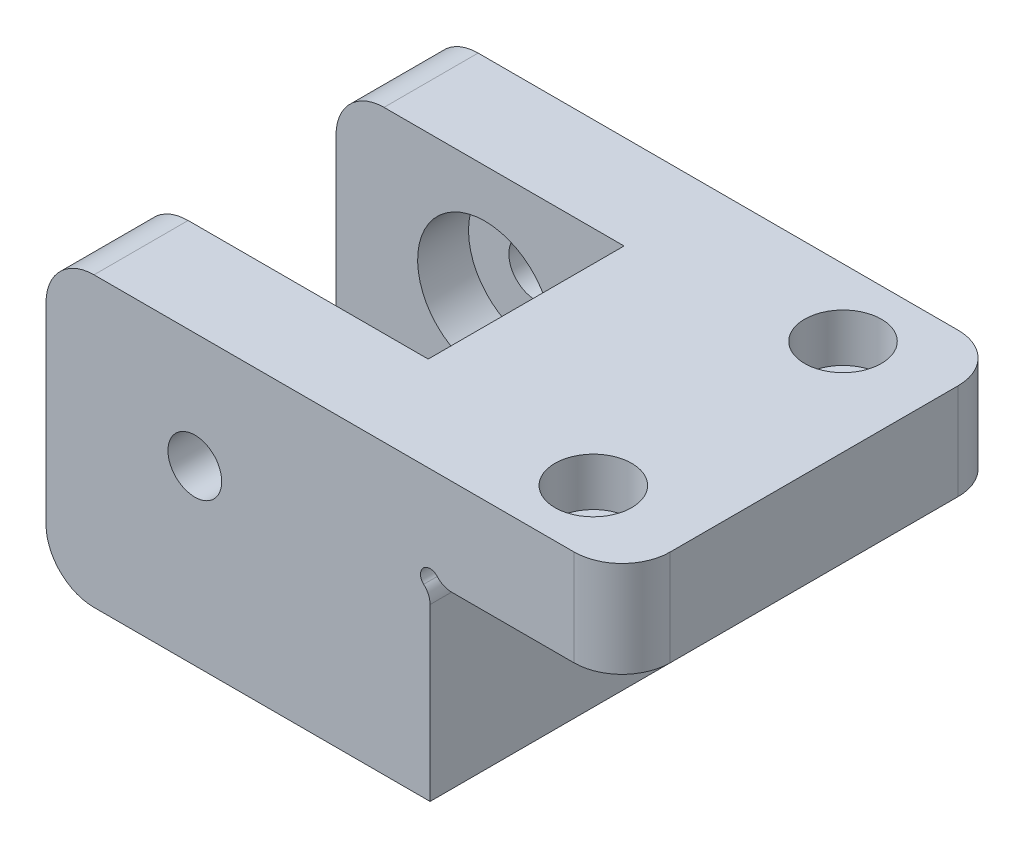
ISO-10303-21;
HEADER;
FILE_DESCRIPTION(('STEP AP214'),'2;1');
FILE_NAME('part.step','',(''),(''),'','','');
FILE_SCHEMA(('AUTOMOTIVE_DESIGN { 1 0 10303 214 1 1 1 1 }'));
ENDSEC;
DATA;
#1=APPLICATION_CONTEXT('core data for automotive mechanical design processes');
#2=APPLICATION_PROTOCOL_DEFINITION('international standard','automotive_design',2000,#1);
#3=PRODUCT_CONTEXT('',#1,'mechanical');
#4=PRODUCT('Part','Part','',(#3));
#5=PRODUCT_RELATED_PRODUCT_CATEGORY('part','',(#4));
#6=PRODUCT_DEFINITION_FORMATION('','',#4);
#7=PRODUCT_DEFINITION_CONTEXT('part definition',#1,'design');
#8=PRODUCT_DEFINITION('design','',#6,#7);
#9=PRODUCT_DEFINITION_SHAPE('','',#8);
#10=(LENGTH_UNIT() NAMED_UNIT(*) SI_UNIT(.MILLI.,.METRE.));
#11=(NAMED_UNIT(*) PLANE_ANGLE_UNIT() SI_UNIT($,.RADIAN.));
#12=(NAMED_UNIT(*) SI_UNIT($,.STERADIAN.) SOLID_ANGLE_UNIT());
#13=UNCERTAINTY_MEASURE_WITH_UNIT(LENGTH_MEASURE(1.E-05),#10,'distance_accuracy_value','');
#14=(GEOMETRIC_REPRESENTATION_CONTEXT(3) GLOBAL_UNCERTAINTY_ASSIGNED_CONTEXT((#13)) GLOBAL_UNIT_ASSIGNED_CONTEXT((#10,
#11,#12)) REPRESENTATION_CONTEXT('',''));
#15=CARTESIAN_POINT('',(0.,0.,0.));
#16=DIRECTION('',(0.,0.,1.));
#17=DIRECTION('',(1.,0.,0.));
#18=AXIS2_PLACEMENT_3D('',#15,#16,#17);
#19=CARTESIAN_POINT('',(-24.5,18.,0.));
#20=DIRECTION('',(0.,0.,1.));
#21=DIRECTION('',(1.,0.,0.));
#22=AXIS2_PLACEMENT_3D('',#19,#20,#21);
#23=CYLINDRICAL_SURFACE('',#22,7.);
#24=CARTESIAN_POINT('',(-24.5,18.,9.8));
#25=DIRECTION('',(0.,0.,-1.));
#26=DIRECTION('',(0.,1.,0.));
#27=AXIS2_PLACEMENT_3D('',#24,#25,#26);
#28=CIRCLE('',#27,7.);
#29=CARTESIAN_POINT('',(-24.5,25.,9.8));
#30=VERTEX_POINT('',#29);
#31=EDGE_CURVE('E297',#30,#30,#28,.T.);
#32=ORIENTED_EDGE('',*,*,#31,.F.);
#33=EDGE_LOOP('',(#32));
#34=FACE_BOUND('',#33,.T.);
#35=CARTESIAN_POINT('',(-24.5,18.,4.5));
#36=DIRECTION('',(0.,0.,-1.));
#37=DIRECTION('',(-1.,0.,0.));
#38=AXIS2_PLACEMENT_3D('',#35,#36,#37);
#39=CIRCLE('',#38,7.);
#40=CARTESIAN_POINT('',(-31.5,18.,4.5));
#41=VERTEX_POINT('',#40);
#42=EDGE_CURVE('E11',#41,#41,#39,.F.);
#43=ORIENTED_EDGE('',*,*,#42,.F.);
#44=EDGE_LOOP('',(#43));
#45=FACE_BOUND('',#44,.T.);
#46=ADVANCED_FACE('F45',(#34,#45),#23,.F.);
#47=CARTESIAN_POINT('',(-24.5,18.,30.2));
#48=DIRECTION('',(0.,0.,1.));
#49=DIRECTION('',(1.,0.,0.));
#50=AXIS2_PLACEMENT_3D('',#47,#48,#49);
#51=CIRCLE('',#50,7.);
#52=CARTESIAN_POINT('',(-17.5,18.,30.2));
#53=VERTEX_POINT('',#52);
#54=EDGE_CURVE('E301',#53,#53,#51,.T.);
#55=ORIENTED_EDGE('',*,*,#54,.F.);
#56=EDGE_LOOP('',(#55));
#57=FACE_BOUND('',#56,.T.);
#58=CARTESIAN_POINT('',(-24.5,18.,35.5));
#59=DIRECTION('',(0.,0.,1.));
#60=DIRECTION('',(1.,0.,0.));
#61=AXIS2_PLACEMENT_3D('',#58,#59,#60);
#62=CIRCLE('',#61,7.);
#63=CARTESIAN_POINT('',(-17.5,18.,35.5));
#64=VERTEX_POINT('',#63);
#65=EDGE_CURVE('E55',#64,#64,#62,.F.);
#66=ORIENTED_EDGE('',*,*,#65,.F.);
#67=EDGE_LOOP('',(#66));
#68=FACE_BOUND('',#67,.T.);
#69=ADVANCED_FACE('F383',(#57,#68),#23,.F.);
#70=CARTESIAN_POINT('',(-10.,30.,40.));
#71=DIRECTION('',(1.,0.,0.));
#72=DIRECTION('',(0.,1.,0.));
#73=AXIS2_PLACEMENT_3D('',#70,#71,#72);
#74=PLANE('',#73);
#75=CARTESIAN_POINT('',(-10.,10.,20.));
#76=DIRECTION('',(-1.,0.,0.));
#77=DIRECTION('',(0.,-1.,0.));
#78=AXIS2_PLACEMENT_3D('',#75,#76,#77);
#79=CIRCLE('',#78,4.);
#80=CARTESIAN_POINT('',(-10.,6.,20.));
#81=VERTEX_POINT('',#80);
#82=EDGE_CURVE('E531',#81,#81,#79,.T.);
#83=ORIENTED_EDGE('',*,*,#82,.F.);
#84=EDGE_LOOP('',(#83));
#85=FACE_BOUND('',#84,.T.);
#86=DIRECTION('',(0.,1.,0.));
#87=VECTOR('',#86,1.);
#88=CARTESIAN_POINT('',(-10.,30.,9.8));
#89=LINE('',#88,#87);
#90=CARTESIAN_POINT('',(-10.,0.,9.8));
#91=VERTEX_POINT('',#90);
#92=CARTESIAN_POINT('',(-10.,30.,9.8));
#93=VERTEX_POINT('',#92);
#94=EDGE_CURVE('E201',#91,#93,#89,.T.);
#95=ORIENTED_EDGE('',*,*,#94,.F.);
#96=DIRECTION('',(0.,0.,-1.));
#97=VECTOR('',#96,1.);
#98=CARTESIAN_POINT('',(-10.,0.,40.));
#99=LINE('',#98,#97);
#100=CARTESIAN_POINT('',(-10.,0.,30.2));
#101=VERTEX_POINT('',#100);
#102=EDGE_CURVE('E183',#101,#91,#99,.T.);
#103=ORIENTED_EDGE('',*,*,#102,.F.);
#104=DIRECTION('',(0.,-1.,0.));
#105=VECTOR('',#104,1.);
#106=CARTESIAN_POINT('',(-10.,0.,30.2));
#107=LINE('',#106,#105);
#108=CARTESIAN_POINT('',(-10.,30.,30.2));
#109=VERTEX_POINT('',#108);
#110=EDGE_CURVE('E198',#109,#101,#107,.T.);
#111=ORIENTED_EDGE('',*,*,#110,.F.);
#112=DIRECTION('',(0.,0.,-1.));
#113=VECTOR('',#112,1.);
#114=CARTESIAN_POINT('',(-10.,30.,40.));
#115=LINE('',#114,#113);
#116=EDGE_CURVE('E203',#109,#93,#115,.T.);
#117=ORIENTED_EDGE('',*,*,#116,.T.);
#118=EDGE_LOOP('',(#95,#103,#111,#117));
#119=FACE_BOUND('',#118,.T.);
#120=ADVANCED_FACE('F196',(#85,#119),#74,.F.);
#121=CARTESIAN_POINT('',(-10.,0.,40.));
#122=DIRECTION('',(0.,1.,0.));
#123=DIRECTION('',(0.,0.,1.));
#124=AXIS2_PLACEMENT_3D('',#121,#122,#123);
#125=PLANE('',#124);
#126=DIRECTION('',(1.,0.,0.));
#127=VECTOR('',#126,1.);
#128=CARTESIAN_POINT('',(-40.,0.,9.80000000000001));
#129=LINE('',#128,#127);
#130=CARTESIAN_POINT('',(-35.,0.,9.80000000000001));
#131=VERTEX_POINT('',#130);
#132=EDGE_CURVE('E523',#131,#91,#129,.T.);
#133=ORIENTED_EDGE('',*,*,#132,.F.);
#134=DIRECTION('',(0.,0.,1.));
#135=VECTOR('',#134,1.);
#136=CARTESIAN_POINT('',(-35.,0.,0.));
#137=LINE('',#136,#135);
#138=CARTESIAN_POINT('',(-35.,0.,0.));
#139=VERTEX_POINT('',#138);
#140=EDGE_CURVE('E344',#131,#139,#137,.F.);
#141=ORIENTED_EDGE('',*,*,#140,.T.);
#142=DIRECTION('',(1.,0.,0.));
#143=VECTOR('',#142,1.);
#144=CARTESIAN_POINT('',(-10.,0.,0.));
#145=LINE('',#144,#143);
#146=CARTESIAN_POINT('',(0.,0.,0.));
#147=VERTEX_POINT('',#146);
#148=EDGE_CURVE('E220',#139,#147,#145,.T.);
#149=ORIENTED_EDGE('',*,*,#148,.T.);
#150=DIRECTION('',(0.,0.,-1.));
#151=VECTOR('',#150,1.);
#152=CARTESIAN_POINT('',(0.,0.,40.));
#153=LINE('',#152,#151);
#154=CARTESIAN_POINT('',(0.,0.,40.));
#155=VERTEX_POINT('',#154);
#156=EDGE_CURVE('E292',#155,#147,#153,.T.);
#157=ORIENTED_EDGE('',*,*,#156,.F.);
#158=DIRECTION('',(1.,0.,0.));
#159=VECTOR('',#158,1.);
#160=CARTESIAN_POINT('',(-10.,0.,40.));
#161=LINE('',#160,#159);
#162=CARTESIAN_POINT('',(-35.,0.,40.));
#163=VERTEX_POINT('',#162);
#164=EDGE_CURVE('E221',#163,#155,#161,.T.);
#165=ORIENTED_EDGE('',*,*,#164,.F.);
#166=DIRECTION('',(0.,0.,1.));
#167=VECTOR('',#166,1.);
#168=CARTESIAN_POINT('',(-35.,0.,30.2));
#169=LINE('',#168,#167);
#170=CARTESIAN_POINT('',(-35.,0.,30.2));
#171=VERTEX_POINT('',#170);
#172=EDGE_CURVE('E186',#163,#171,#169,.F.);
#173=ORIENTED_EDGE('',*,*,#172,.T.);
#174=DIRECTION('',(1.,0.,0.));
#175=VECTOR('',#174,1.);
#176=CARTESIAN_POINT('',(-40.,0.,30.2));
#177=LINE('',#176,#175);
#178=EDGE_CURVE('E179',#171,#101,#177,.T.);
#179=ORIENTED_EDGE('',*,*,#178,.T.);
#180=ORIENTED_EDGE('',*,*,#102,.T.);
#181=EDGE_LOOP('',(#133,#141,#149,#157,#165,#173,#179,#180));
#182=FACE_BOUND('',#181,.T.);
#183=ADVANCED_FACE('F182',(#182),#125,.F.);
#184=CARTESIAN_POINT('',(0.,0.,40.));
#185=DIRECTION('',(-1.,0.,0.));
#186=DIRECTION('',(0.,0.,1.));
#187=AXIS2_PLACEMENT_3D('',#184,#185,#186);
#188=PLANE('',#187);
#189=CARTESIAN_POINT('',(0.,10.,20.));
#190=DIRECTION('',(-1.,0.,0.));
#191=DIRECTION('',(0.,-1.,0.));
#192=AXIS2_PLACEMENT_3D('',#189,#190,#191);
#193=CIRCLE('',#192,2.1);
#194=CARTESIAN_POINT('',(0.,7.9,20.));
#195=VERTEX_POINT('',#194);
#196=EDGE_CURVE('E535',#195,#195,#193,.T.);
#197=ORIENTED_EDGE('',*,*,#196,.T.);
#198=EDGE_LOOP('',(#197));
#199=FACE_BOUND('',#198,.T.);
#200=DIRECTION('',(0.,1.,0.));
#201=VECTOR('',#200,1.);
#202=CARTESIAN_POINT('',(0.,0.,0.));
#203=LINE('',#202,#201);
#204=CARTESIAN_POINT('',(0.,17.7639320225002,0.));
#205=VERTEX_POINT('',#204);
#206=EDGE_CURVE('E247',#147,#205,#203,.T.);
#207=ORIENTED_EDGE('',*,*,#206,.T.);
#208=DIRECTION('',(0.,0.,-1.));
#209=VECTOR('',#208,1.);
#210=CARTESIAN_POINT('',(0.,17.7639320225002,40.));
#211=LINE('',#210,#209);
#212=CARTESIAN_POINT('',(0.,17.7639320225002,40.));
#213=VERTEX_POINT('',#212);
#214=EDGE_CURVE('E288',#213,#205,#211,.T.);
#215=ORIENTED_EDGE('',*,*,#214,.F.);
#216=DIRECTION('',(0.,1.,0.));
#217=VECTOR('',#216,1.);
#218=CARTESIAN_POINT('',(0.,0.,40.));
#219=LINE('',#218,#217);
#220=EDGE_CURVE('E224',#155,#213,#219,.T.);
#221=ORIENTED_EDGE('',*,*,#220,.F.);
#222=ORIENTED_EDGE('',*,*,#156,.T.);
#223=EDGE_LOOP('',(#207,#215,#221,#222));
#224=FACE_BOUND('',#223,.T.);
#225=ADVANCED_FACE('F446',(#199,#224),#188,.F.);
#226=CARTESIAN_POINT('',(-2.,17.7639320225002,40.));
#227=DIRECTION('',(0.,0.,-1.));
#228=DIRECTION('',(-1.,0.,0.));
#229=AXIS2_PLACEMENT_3D('',#226,#227,#228);
#230=CYLINDRICAL_SURFACE('',#229,2.);
#231=CARTESIAN_POINT('',(-2.,17.7639320225002,0.));
#232=DIRECTION('',(0.,0.,1.));
#233=DIRECTION('',(1.,0.,0.));
#234=AXIS2_PLACEMENT_3D('',#231,#232,#233);
#235=CIRCLE('',#234,2.);
#236=CARTESIAN_POINT('',(-0.666666666666668,19.2546440075001,0.));
#237=VERTEX_POINT('',#236);
#238=EDGE_CURVE('E250',#205,#237,#235,.T.);
#239=ORIENTED_EDGE('',*,*,#238,.T.);
#240=DIRECTION('',(0.,0.,-1.));
#241=VECTOR('',#240,1.);
#242=CARTESIAN_POINT('',(-0.666666666666668,19.2546440075001,40.));
#243=LINE('',#242,#241);
#244=CARTESIAN_POINT('',(-0.666666666666668,19.2546440075001,40.));
#245=VERTEX_POINT('',#244);
#246=EDGE_CURVE('E285',#245,#237,#243,.T.);
#247=ORIENTED_EDGE('',*,*,#246,.F.);
#248=CARTESIAN_POINT('',(-2.,17.7639320225002,40.));
#249=DIRECTION('',(0.,0.,1.));
#250=DIRECTION('',(1.,0.,0.));
#251=AXIS2_PLACEMENT_3D('',#248,#249,#250);
#252=CIRCLE('',#251,2.);
#253=EDGE_CURVE('E228',#213,#245,#252,.T.);
#254=ORIENTED_EDGE('',*,*,#253,.F.);
#255=ORIENTED_EDGE('',*,*,#214,.T.);
#256=EDGE_LOOP('',(#239,#247,#254,#255));
#257=FACE_BOUND('',#256,.T.);
#258=ADVANCED_FACE('F442',(#257),#230,.T.);
#259=CARTESIAN_POINT('',(0.,20.,40.));
#260=DIRECTION('',(0.,0.,-1.));
#261=DIRECTION('',(-1.,0.,0.));
#262=AXIS2_PLACEMENT_3D('',#259,#260,#261);
#263=CYLINDRICAL_SURFACE('',#262,1.);
#264=CARTESIAN_POINT('',(0.,20.,0.));
#265=DIRECTION('',(0.,0.,1.));
#266=DIRECTION('',(1.,0.,0.));
#267=AXIS2_PLACEMENT_3D('',#264,#265,#266);
#268=CIRCLE('',#267,1.);
#269=CARTESIAN_POINT('',(0.745355992499931,20.6666666666667,0.));
#270=VERTEX_POINT('',#269);
#271=EDGE_CURVE('E254',#270,#237,#268,.T.);
#272=ORIENTED_EDGE('',*,*,#271,.F.);
#273=DIRECTION('',(0.,0.,-1.));
#274=VECTOR('',#273,1.);
#275=CARTESIAN_POINT('',(0.745355992499931,20.6666666666667,40.));
#276=LINE('',#275,#274);
#277=CARTESIAN_POINT('',(0.745355992499931,20.6666666666667,40.));
#278=VERTEX_POINT('',#277);
#279=EDGE_CURVE('E282',#278,#270,#276,.T.);
#280=ORIENTED_EDGE('',*,*,#279,.F.);
#281=CARTESIAN_POINT('',(0.,20.,40.));
#282=DIRECTION('',(0.,0.,1.));
#283=DIRECTION('',(1.,0.,0.));
#284=AXIS2_PLACEMENT_3D('',#281,#282,#283);
#285=CIRCLE('',#284,1.);
#286=EDGE_CURVE('E231',#278,#245,#285,.T.);
#287=ORIENTED_EDGE('',*,*,#286,.T.);
#288=ORIENTED_EDGE('',*,*,#246,.T.);
#289=EDGE_LOOP('',(#272,#280,#287,#288));
#290=FACE_BOUND('',#289,.T.);
#291=ADVANCED_FACE('F438',(#290),#263,.F.);
#292=CARTESIAN_POINT('',(2.23606797749979,22.,40.));
#293=DIRECTION('',(0.,0.,-1.));
#294=DIRECTION('',(-1.,0.,0.));
#295=AXIS2_PLACEMENT_3D('',#292,#293,#294);
#296=CYLINDRICAL_SURFACE('',#295,2.);
#297=CARTESIAN_POINT('',(2.23606797749979,22.,0.));
#298=DIRECTION('',(0.,0.,-1.));
#299=DIRECTION('',(-1.,0.,0.));
#300=AXIS2_PLACEMENT_3D('',#297,#298,#299);
#301=CIRCLE('',#300,2.);
#302=CARTESIAN_POINT('',(2.23606797749979,20.,0.));
#303=VERTEX_POINT('',#302);
#304=EDGE_CURVE('E258',#303,#270,#301,.T.);
#305=ORIENTED_EDGE('',*,*,#304,.F.);
#306=DIRECTION('',(0.,0.,-1.));
#307=VECTOR('',#306,1.);
#308=CARTESIAN_POINT('',(2.23606797749979,20.,40.));
#309=LINE('',#308,#307);
#310=CARTESIAN_POINT('',(2.23606797749979,20.,40.));
#311=VERTEX_POINT('',#310);
#312=EDGE_CURVE('E279',#311,#303,#309,.T.);
#313=ORIENTED_EDGE('',*,*,#312,.F.);
#314=CARTESIAN_POINT('',(2.23606797749979,22.,40.));
#315=DIRECTION('',(0.,0.,-1.));
#316=DIRECTION('',(-1.,0.,0.));
#317=AXIS2_PLACEMENT_3D('',#314,#315,#316);
#318=CIRCLE('',#317,2.);
#319=EDGE_CURVE('E235',#311,#278,#318,.T.);
#320=ORIENTED_EDGE('',*,*,#319,.T.);
#321=ORIENTED_EDGE('',*,*,#279,.T.);
#322=EDGE_LOOP('',(#305,#313,#320,#321));
#323=FACE_BOUND('',#322,.T.);
#324=ADVANCED_FACE('F434',(#323),#296,.T.);
#325=CARTESIAN_POINT('',(2.23606797749979,20.,40.));
#326=DIRECTION('',(0.,1.,0.));
#327=DIRECTION('',(0.,0.,1.));
#328=AXIS2_PLACEMENT_3D('',#325,#326,#327);
#329=PLANE('',#328);
#330=CARTESIAN_POINT('',(10.,20.,33.));
#331=DIRECTION('',(0.,1.,0.));
#332=DIRECTION('',(-1.,0.,0.));
#333=AXIS2_PLACEMENT_3D('',#330,#331,#332);
#334=CIRCLE('',#333,2.1);
#335=CARTESIAN_POINT('',(7.9,20.,33.));
#336=VERTEX_POINT('',#335);
#337=EDGE_CURVE('E552',#336,#336,#334,.T.);
#338=ORIENTED_EDGE('',*,*,#337,.T.);
#339=EDGE_LOOP('',(#338));
#340=FACE_BOUND('',#339,.T.);
#341=CARTESIAN_POINT('',(10.,20.,7.));
#342=DIRECTION('',(0.,1.,0.));
#343=DIRECTION('',(-1.,0.,0.));
#344=AXIS2_PLACEMENT_3D('',#341,#342,#343);
#345=CIRCLE('',#344,2.1);
#346=CARTESIAN_POINT('',(7.9,20.,7.));
#347=VERTEX_POINT('',#346);
#348=EDGE_CURVE('E567',#347,#347,#345,.T.);
#349=ORIENTED_EDGE('',*,*,#348,.T.);
#350=EDGE_LOOP('',(#349));
#351=FACE_BOUND('',#350,.T.);
#352=DIRECTION('',(1.,0.,0.));
#353=VECTOR('',#352,1.);
#354=CARTESIAN_POINT('',(2.23606797749979,20.,0.));
#355=LINE('',#354,#353);
#356=CARTESIAN_POINT('',(15.,20.,0.));
#357=VERTEX_POINT('',#356);
#358=EDGE_CURVE('E262',#303,#357,#355,.T.);
#359=ORIENTED_EDGE('',*,*,#358,.T.);
#360=CARTESIAN_POINT('',(15.,20.,5.));
#361=DIRECTION('',(0.,1.,0.));
#362=DIRECTION('',(0.,0.,1.));
#363=AXIS2_PLACEMENT_3D('',#360,#361,#362);
#364=CIRCLE('',#363,5.);
#365=CARTESIAN_POINT('',(20.,20.,5.));
#366=VERTEX_POINT('',#365);
#367=EDGE_CURVE('E321',#357,#366,#364,.F.);
#368=ORIENTED_EDGE('',*,*,#367,.T.);
#369=DIRECTION('',(0.,0.,-1.));
#370=VECTOR('',#369,1.);
#371=CARTESIAN_POINT('',(20.,20.,40.));
#372=LINE('',#371,#370);
#373=CARTESIAN_POINT('',(20.,20.,35.));
#374=VERTEX_POINT('',#373);
#375=EDGE_CURVE('E275',#374,#366,#372,.T.);
#376=ORIENTED_EDGE('',*,*,#375,.F.);
#377=CARTESIAN_POINT('',(15.,20.,35.));
#378=DIRECTION('',(0.,1.,0.));
#379=DIRECTION('',(0.,0.,1.));
#380=AXIS2_PLACEMENT_3D('',#377,#378,#379);
#381=CIRCLE('',#380,5.);
#382=CARTESIAN_POINT('',(15.,20.,40.));
#383=VERTEX_POINT('',#382);
#384=EDGE_CURVE('E318',#374,#383,#381,.F.);
#385=ORIENTED_EDGE('',*,*,#384,.T.);
#386=DIRECTION('',(1.,0.,0.));
#387=VECTOR('',#386,1.);
#388=CARTESIAN_POINT('',(2.23606797749979,20.,40.));
#389=LINE('',#388,#387);
#390=EDGE_CURVE('E239',#311,#383,#389,.T.);
#391=ORIENTED_EDGE('',*,*,#390,.F.);
#392=ORIENTED_EDGE('',*,*,#312,.T.);
#393=EDGE_LOOP('',(#359,#368,#376,#385,#391,#392));
#394=FACE_BOUND('',#393,.T.);
#395=ADVANCED_FACE('F430',(#340,#351,#394),#329,.F.);
#396=CARTESIAN_POINT('',(20.,20.,40.));
#397=DIRECTION('',(-1.,0.,0.));
#398=DIRECTION('',(0.,0.,1.));
#399=AXIS2_PLACEMENT_3D('',#396,#397,#398);
#400=PLANE('',#399);
#401=ORIENTED_EDGE('',*,*,#375,.T.);
#402=DIRECTION('',(0.,1.,0.));
#403=VECTOR('',#402,1.);
#404=CARTESIAN_POINT('',(20.,20.,5.));
#405=LINE('',#404,#403);
#406=CARTESIAN_POINT('',(20.,30.,5.));
#407=VERTEX_POINT('',#406);
#408=EDGE_CURVE('E305',#366,#407,#405,.T.);
#409=ORIENTED_EDGE('',*,*,#408,.T.);
#410=DIRECTION('',(0.,0.,-1.));
#411=VECTOR('',#410,1.);
#412=CARTESIAN_POINT('',(20.,30.,40.));
#413=LINE('',#412,#411);
#414=CARTESIAN_POINT('',(20.,30.,35.));
#415=VERTEX_POINT('',#414);
#416=EDGE_CURVE('E271',#415,#407,#413,.T.);
#417=ORIENTED_EDGE('',*,*,#416,.F.);
#418=DIRECTION('',(0.,1.,0.));
#419=VECTOR('',#418,1.);
#420=CARTESIAN_POINT('',(20.,20.,35.));
#421=LINE('',#420,#419);
#422=EDGE_CURVE('E296',#415,#374,#421,.F.);
#423=ORIENTED_EDGE('',*,*,#422,.T.);
#424=EDGE_LOOP('',(#401,#409,#417,#423));
#425=FACE_BOUND('',#424,.T.);
#426=ADVANCED_FACE('F426',(#425),#400,.F.);
#427=CARTESIAN_POINT('',(20.,30.,40.));
#428=DIRECTION('',(0.,-1.,0.));
#429=DIRECTION('',(1.,0.,0.));
#430=AXIS2_PLACEMENT_3D('',#427,#428,#429);
#431=PLANE('',#430);
#432=CARTESIAN_POINT('',(10.,30.,33.));
#433=DIRECTION('',(0.,1.,0.));
#434=DIRECTION('',(-1.,0.,0.));
#435=AXIS2_PLACEMENT_3D('',#432,#433,#434);
#436=CIRCLE('',#435,4.);
#437=CARTESIAN_POINT('',(6.,30.,33.));
#438=VERTEX_POINT('',#437);
#439=EDGE_CURVE('E556',#438,#438,#436,.T.);
#440=ORIENTED_EDGE('',*,*,#439,.F.);
#441=EDGE_LOOP('',(#440));
#442=FACE_BOUND('',#441,.T.);
#443=CARTESIAN_POINT('',(10.,30.,7.));
#444=DIRECTION('',(0.,1.,0.));
#445=DIRECTION('',(-1.,0.,0.));
#446=AXIS2_PLACEMENT_3D('',#443,#444,#445);
#447=CIRCLE('',#446,4.);
#448=CARTESIAN_POINT('',(6.,30.,7.));
#449=VERTEX_POINT('',#448);
#450=EDGE_CURVE('E547',#449,#449,#447,.T.);
#451=ORIENTED_EDGE('',*,*,#450,.F.);
#452=EDGE_LOOP('',(#451));
#453=FACE_BOUND('',#452,.T.);
#454=DIRECTION('',(1.,0.,0.));
#455=VECTOR('',#454,1.);
#456=CARTESIAN_POINT('',(-40.,30.,30.2));
#457=LINE('',#456,#455);
#458=CARTESIAN_POINT('',(-35.,30.,30.2));
#459=VERTEX_POINT('',#458);
#460=EDGE_CURVE('E190',#459,#109,#457,.T.);
#461=ORIENTED_EDGE('',*,*,#460,.F.);
#462=DIRECTION('',(0.,0.,-1.));
#463=VECTOR('',#462,1.);
#464=CARTESIAN_POINT('',(-35.,30.,40.));
#465=LINE('',#464,#463);
#466=CARTESIAN_POINT('',(-35.,30.,40.));
#467=VERTEX_POINT('',#466);
#468=EDGE_CURVE('E69',#459,#467,#465,.F.);
#469=ORIENTED_EDGE('',*,*,#468,.T.);
#470=DIRECTION('',(-1.,0.,0.));
#471=VECTOR('',#470,1.);
#472=CARTESIAN_POINT('',(20.,30.,40.));
#473=LINE('',#472,#471);
#474=CARTESIAN_POINT('',(15.,30.,40.));
#475=VERTEX_POINT('',#474);
#476=EDGE_CURVE('E204',#475,#467,#473,.T.);
#477=ORIENTED_EDGE('',*,*,#476,.F.);
#478=CARTESIAN_POINT('',(15.,30.,35.));
#479=DIRECTION('',(0.,-1.,0.));
#480=DIRECTION('',(1.,0.,0.));
#481=AXIS2_PLACEMENT_3D('',#478,#479,#480);
#482=CIRCLE('',#481,5.);
#483=EDGE_CURVE('E309',#475,#415,#482,.F.);
#484=ORIENTED_EDGE('',*,*,#483,.T.);
#485=ORIENTED_EDGE('',*,*,#416,.T.);
#486=CARTESIAN_POINT('',(15.,30.,5.));
#487=DIRECTION('',(0.,-1.,0.));
#488=DIRECTION('',(1.,0.,0.));
#489=AXIS2_PLACEMENT_3D('',#486,#487,#488);
#490=CIRCLE('',#489,5.);
#491=CARTESIAN_POINT('',(15.,30.,0.));
#492=VERTEX_POINT('',#491);
#493=EDGE_CURVE('E312',#407,#492,#490,.F.);
#494=ORIENTED_EDGE('',*,*,#493,.T.);
#495=DIRECTION('',(-1.,0.,0.));
#496=VECTOR('',#495,1.);
#497=CARTESIAN_POINT('',(20.,30.,0.));
#498=LINE('',#497,#496);
#499=CARTESIAN_POINT('',(-35.,30.,0.));
#500=VERTEX_POINT('',#499);
#501=EDGE_CURVE('E225',#492,#500,#498,.T.);
#502=ORIENTED_EDGE('',*,*,#501,.T.);
#503=DIRECTION('',(0.,0.,-1.));
#504=VECTOR('',#503,1.);
#505=CARTESIAN_POINT('',(-35.,30.,9.8));
#506=LINE('',#505,#504);
#507=CARTESIAN_POINT('',(-35.,30.,9.8));
#508=VERTEX_POINT('',#507);
#509=EDGE_CURVE('E372',#500,#508,#506,.F.);
#510=ORIENTED_EDGE('',*,*,#509,.T.);
#511=DIRECTION('',(1.,0.,0.));
#512=VECTOR('',#511,1.);
#513=CARTESIAN_POINT('',(-40.,30.,9.8));
#514=LINE('',#513,#512);
#515=EDGE_CURVE('E518',#508,#93,#514,.T.);
#516=ORIENTED_EDGE('',*,*,#515,.T.);
#517=ORIENTED_EDGE('',*,*,#116,.F.);
#518=EDGE_LOOP('',(#461,#469,#477,#484,#485,#494,#502,#510,#516,#517));
#519=FACE_BOUND('',#518,.T.);
#520=ADVANCED_FACE('F419',(#442,#453,#519),#431,.F.);
#521=CARTESIAN_POINT('',(-2.,17.7639320225002,40.));
#522=DIRECTION('',(0.,0.,1.));
#523=DIRECTION('',(1.,0.,0.));
#524=AXIS2_PLACEMENT_3D('',#521,#522,#523);
#525=PLANE('',#524);
#526=CARTESIAN_POINT('',(-24.5,18.,40.));
#527=DIRECTION('',(0.,0.,1.));
#528=DIRECTION('',(1.,0.,0.));
#529=AXIS2_PLACEMENT_3D('',#526,#527,#528);
#530=CIRCLE('',#529,2.8);
#531=CARTESIAN_POINT('',(-21.7,18.,40.));
#532=VERTEX_POINT('',#531);
#533=EDGE_CURVE('E582',#532,#532,#530,.T.);
#534=ORIENTED_EDGE('',*,*,#533,.F.);
#535=EDGE_LOOP('',(#534));
#536=FACE_BOUND('',#535,.T.);
#537=DIRECTION('',(0.,1.,0.));
#538=VECTOR('',#537,1.);
#539=CARTESIAN_POINT('',(-40.,0.,40.));
#540=LINE('',#539,#538);
#541=CARTESIAN_POINT('',(-40.,5.,40.));
#542=VERTEX_POINT('',#541);
#543=CARTESIAN_POINT('',(-40.,25.,40.));
#544=VERTEX_POINT('',#543);
#545=EDGE_CURVE('E208',#542,#544,#540,.T.);
#546=ORIENTED_EDGE('',*,*,#545,.F.);
#547=CARTESIAN_POINT('',(-35.,5.,40.));
#548=DIRECTION('',(0.,0.,1.));
#549=DIRECTION('',(1.,0.,0.));
#550=AXIS2_PLACEMENT_3D('',#547,#548,#549);
#551=CIRCLE('',#550,5.);
#552=EDGE_CURVE('E364',#542,#163,#551,.T.);
#553=ORIENTED_EDGE('',*,*,#552,.T.);
#554=ORIENTED_EDGE('',*,*,#164,.T.);
#555=ORIENTED_EDGE('',*,*,#220,.T.);
#556=ORIENTED_EDGE('',*,*,#253,.T.);
#557=ORIENTED_EDGE('',*,*,#286,.F.);
#558=ORIENTED_EDGE('',*,*,#319,.F.);
#559=ORIENTED_EDGE('',*,*,#390,.T.);
#560=DIRECTION('',(0.,1.,0.));
#561=VECTOR('',#560,1.);
#562=CARTESIAN_POINT('',(15.,30.,40.));
#563=LINE('',#562,#561);
#564=EDGE_CURVE('E324',#383,#475,#563,.T.);
#565=ORIENTED_EDGE('',*,*,#564,.T.);
#566=ORIENTED_EDGE('',*,*,#476,.T.);
#567=CARTESIAN_POINT('',(-35.,25.,40.));
#568=DIRECTION('',(0.,0.,1.));
#569=DIRECTION('',(1.,0.,0.));
#570=AXIS2_PLACEMENT_3D('',#567,#568,#569);
#571=CIRCLE('',#570,5.);
#572=EDGE_CURVE('E361',#467,#544,#571,.T.);
#573=ORIENTED_EDGE('',*,*,#572,.T.);
#574=EDGE_LOOP('',(#546,#553,#554,#555,#556,#557,#558,#559,#565,#566,#573));
#575=FACE_BOUND('',#574,.T.);
#576=ADVANCED_FACE('F416',(#536,#575),#525,.T.);
#577=CARTESIAN_POINT('',(-2.,17.7639320225002,0.));
#578=DIRECTION('',(0.,0.,1.));
#579=DIRECTION('',(1.,0.,0.));
#580=AXIS2_PLACEMENT_3D('',#577,#578,#579);
#581=PLANE('',#580);
#582=CARTESIAN_POINT('',(-24.5,18.,0.));
#583=DIRECTION('',(0.,0.,1.));
#584=DIRECTION('',(1.,0.,0.));
#585=AXIS2_PLACEMENT_3D('',#582,#583,#584);
#586=CIRCLE('',#585,2.8);
#587=CARTESIAN_POINT('',(-21.7,18.,0.));
#588=VERTEX_POINT('',#587);
#589=EDGE_CURVE('E586',#588,#588,#586,.T.);
#590=ORIENTED_EDGE('',*,*,#589,.T.);
#591=EDGE_LOOP('',(#590));
#592=FACE_BOUND('',#591,.T.);
#593=ORIENTED_EDGE('',*,*,#148,.F.);
#594=CARTESIAN_POINT('',(-35.,5.,0.));
#595=DIRECTION('',(0.,0.,1.));
#596=DIRECTION('',(1.,0.,0.));
#597=AXIS2_PLACEMENT_3D('',#594,#595,#596);
#598=CIRCLE('',#597,5.);
#599=CARTESIAN_POINT('',(-40.,5.00000000000001,0.));
#600=VERTEX_POINT('',#599);
#601=EDGE_CURVE('E350',#139,#600,#598,.F.);
#602=ORIENTED_EDGE('',*,*,#601,.T.);
#603=DIRECTION('',(0.,-1.,0.));
#604=VECTOR('',#603,1.);
#605=CARTESIAN_POINT('',(-40.,30.,0.));
#606=LINE('',#605,#604);
#607=CARTESIAN_POINT('',(-40.,25.,0.));
#608=VERTEX_POINT('',#607);
#609=EDGE_CURVE('E214',#608,#600,#606,.T.);
#610=ORIENTED_EDGE('',*,*,#609,.F.);
#611=CARTESIAN_POINT('',(-35.,25.,0.));
#612=DIRECTION('',(0.,0.,1.));
#613=DIRECTION('',(1.,0.,0.));
#614=AXIS2_PLACEMENT_3D('',#611,#612,#613);
#615=CIRCLE('',#614,5.);
#616=EDGE_CURVE('E347',#608,#500,#615,.F.);
#617=ORIENTED_EDGE('',*,*,#616,.T.);
#618=ORIENTED_EDGE('',*,*,#501,.F.);
#619=DIRECTION('',(0.,1.,0.));
#620=VECTOR('',#619,1.);
#621=CARTESIAN_POINT('',(15.,17.7639320225002,0.));
#622=LINE('',#621,#620);
#623=EDGE_CURVE('E315',#492,#357,#622,.F.);
#624=ORIENTED_EDGE('',*,*,#623,.T.);
#625=ORIENTED_EDGE('',*,*,#358,.F.);
#626=ORIENTED_EDGE('',*,*,#304,.T.);
#627=ORIENTED_EDGE('',*,*,#271,.T.);
#628=ORIENTED_EDGE('',*,*,#238,.F.);
#629=ORIENTED_EDGE('',*,*,#206,.F.);
#630=EDGE_LOOP('',(#593,#602,#610,#617,#618,#624,#625,#626,#627,#628,#629));
#631=FACE_BOUND('',#630,.T.);
#632=ADVANCED_FACE('F414',(#592,#631),#581,.F.);
#633=CARTESIAN_POINT('',(-40.,0.,30.2));
#634=DIRECTION('',(0.,0.,1.));
#635=DIRECTION('',(1.,0.,0.));
#636=AXIS2_PLACEMENT_3D('',#633,#634,#635);
#637=PLANE('',#636);
#638=ORIENTED_EDGE('',*,*,#54,.T.);
#639=EDGE_LOOP('',(#638));
#640=FACE_BOUND('',#639,.T.);
#641=ORIENTED_EDGE('',*,*,#178,.F.);
#642=CARTESIAN_POINT('',(-35.,5.,30.2));
#643=DIRECTION('',(0.,0.,1.));
#644=DIRECTION('',(1.,0.,0.));
#645=AXIS2_PLACEMENT_3D('',#642,#643,#644);
#646=CIRCLE('',#645,5.);
#647=CARTESIAN_POINT('',(-40.,5.,30.2));
#648=VERTEX_POINT('',#647);
#649=EDGE_CURVE('E369',#171,#648,#646,.F.);
#650=ORIENTED_EDGE('',*,*,#649,.T.);
#651=DIRECTION('',(0.,-1.,0.));
#652=VECTOR('',#651,1.);
#653=CARTESIAN_POINT('',(-40.,0.,30.2));
#654=LINE('',#653,#652);
#655=CARTESIAN_POINT('',(-40.,25.,30.2));
#656=VERTEX_POINT('',#655);
#657=EDGE_CURVE('E191',#656,#648,#654,.T.);
#658=ORIENTED_EDGE('',*,*,#657,.F.);
#659=CARTESIAN_POINT('',(-35.,25.,30.2));
#660=DIRECTION('',(0.,0.,1.));
#661=DIRECTION('',(1.,0.,0.));
#662=AXIS2_PLACEMENT_3D('',#659,#660,#661);
#663=CIRCLE('',#662,5.);
#664=EDGE_CURVE('E62',#656,#459,#663,.F.);
#665=ORIENTED_EDGE('',*,*,#664,.T.);
#666=ORIENTED_EDGE('',*,*,#460,.T.);
#667=ORIENTED_EDGE('',*,*,#110,.T.);
#668=EDGE_LOOP('',(#641,#650,#658,#665,#666,#667));
#669=FACE_BOUND('',#668,.T.);
#670=ADVANCED_FACE('F206',(#640,#669),#637,.F.);
#671=CARTESIAN_POINT('',(-40.,0.,0.));
#672=DIRECTION('',(-1.,0.,0.));
#673=DIRECTION('',(0.,-1.,0.));
#674=AXIS2_PLACEMENT_3D('',#671,#672,#673);
#675=PLANE('',#674);
#676=ORIENTED_EDGE('',*,*,#657,.T.);
#677=DIRECTION('',(0.,0.,1.));
#678=VECTOR('',#677,1.);
#679=CARTESIAN_POINT('',(-40.,5.,40.));
#680=LINE('',#679,#678);
#681=EDGE_CURVE('E357',#648,#542,#680,.T.);
#682=ORIENTED_EDGE('',*,*,#681,.T.);
#683=ORIENTED_EDGE('',*,*,#545,.T.);
#684=DIRECTION('',(0.,0.,-1.));
#685=VECTOR('',#684,1.);
#686=CARTESIAN_POINT('',(-40.,25.,30.2));
#687=LINE('',#686,#685);
#688=EDGE_CURVE('E353',#544,#656,#687,.T.);
#689=ORIENTED_EDGE('',*,*,#688,.T.);
#690=EDGE_LOOP('',(#676,#682,#683,#689));
#691=FACE_BOUND('',#690,.T.);
#692=ADVANCED_FACE('F404',(#691),#675,.T.);
#693=CARTESIAN_POINT('',(-40.,30.,9.8));
#694=DIRECTION('',(0.,0.,-1.));
#695=DIRECTION('',(0.,1.,0.));
#696=AXIS2_PLACEMENT_3D('',#693,#694,#695);
#697=PLANE('',#696);
#698=ORIENTED_EDGE('',*,*,#31,.T.);
#699=EDGE_LOOP('',(#698));
#700=FACE_BOUND('',#699,.T.);
#701=DIRECTION('',(0.,1.,0.));
#702=VECTOR('',#701,1.);
#703=CARTESIAN_POINT('',(-40.,30.,9.8));
#704=LINE('',#703,#702);
#705=CARTESIAN_POINT('',(-40.,5.00000000000001,9.8));
#706=VERTEX_POINT('',#705);
#707=CARTESIAN_POINT('',(-40.,25.,9.8));
#708=VERTEX_POINT('',#707);
#709=EDGE_CURVE('E515',#706,#708,#704,.T.);
#710=ORIENTED_EDGE('',*,*,#709,.F.);
#711=CARTESIAN_POINT('',(-35.,5.,9.8));
#712=DIRECTION('',(0.,0.,-1.));
#713=DIRECTION('',(0.,1.,0.));
#714=AXIS2_PLACEMENT_3D('',#711,#712,#713);
#715=CIRCLE('',#714,5.);
#716=EDGE_CURVE('E339',#706,#131,#715,.F.);
#717=ORIENTED_EDGE('',*,*,#716,.T.);
#718=ORIENTED_EDGE('',*,*,#132,.T.);
#719=ORIENTED_EDGE('',*,*,#94,.T.);
#720=ORIENTED_EDGE('',*,*,#515,.F.);
#721=CARTESIAN_POINT('',(-35.,25.,9.8));
#722=DIRECTION('',(0.,0.,-1.));
#723=DIRECTION('',(0.,1.,0.));
#724=AXIS2_PLACEMENT_3D('',#721,#722,#723);
#725=CIRCLE('',#724,5.);
#726=EDGE_CURVE('E336',#508,#708,#725,.F.);
#727=ORIENTED_EDGE('',*,*,#726,.T.);
#728=EDGE_LOOP('',(#710,#717,#718,#719,#720,#727));
#729=FACE_BOUND('',#728,.T.);
#730=ADVANCED_FACE('F400',(#700,#729),#697,.F.);
#731=CARTESIAN_POINT('',(-40.,0.,0.));
#732=DIRECTION('',(-1.,0.,0.));
#733=DIRECTION('',(0.,-1.,0.));
#734=AXIS2_PLACEMENT_3D('',#731,#732,#733);
#735=PLANE('',#734);
#736=ORIENTED_EDGE('',*,*,#609,.T.);
#737=DIRECTION('',(0.,0.,1.));
#738=VECTOR('',#737,1.);
#739=CARTESIAN_POINT('',(-40.,5.,9.80000000000001));
#740=LINE('',#739,#738);
#741=EDGE_CURVE('E332',#600,#706,#740,.T.);
#742=ORIENTED_EDGE('',*,*,#741,.T.);
#743=ORIENTED_EDGE('',*,*,#709,.T.);
#744=DIRECTION('',(0.,0.,-1.));
#745=VECTOR('',#744,1.);
#746=CARTESIAN_POINT('',(-40.,25.,0.));
#747=LINE('',#746,#745);
#748=EDGE_CURVE('E328',#708,#608,#747,.T.);
#749=ORIENTED_EDGE('',*,*,#748,.T.);
#750=EDGE_LOOP('',(#736,#742,#743,#749));
#751=FACE_BOUND('',#750,.T.);
#752=ADVANCED_FACE('F403',(#751),#735,.T.);
#753=CARTESIAN_POINT('',(-5.,10.,20.));
#754=DIRECTION('',(-1.,0.,0.));
#755=DIRECTION('',(0.,-1.,0.));
#756=AXIS2_PLACEMENT_3D('',#753,#754,#755);
#757=CYLINDRICAL_SURFACE('',#756,4.);
#758=CARTESIAN_POINT('',(-5.,10.,20.));
#759=DIRECTION('',(-1.,0.,0.));
#760=DIRECTION('',(0.,-1.,0.));
#761=AXIS2_PLACEMENT_3D('',#758,#759,#760);
#762=CIRCLE('',#761,4.);
#763=CARTESIAN_POINT('',(-5.,6.,20.));
#764=VERTEX_POINT('',#763);
#765=EDGE_CURVE('E302',#764,#764,#762,.T.);
#766=ORIENTED_EDGE('',*,*,#765,.F.);
#767=EDGE_LOOP('',(#766));
#768=FACE_BOUND('',#767,.T.);
#769=ORIENTED_EDGE('',*,*,#82,.T.);
#770=EDGE_LOOP('',(#769));
#771=FACE_BOUND('',#770,.T.);
#772=ADVANCED_FACE('F398',(#768,#771),#757,.F.);
#773=CARTESIAN_POINT('',(-5.,0.,0.));
#774=DIRECTION('',(-1.,0.,0.));
#775=DIRECTION('',(0.,-1.,0.));
#776=AXIS2_PLACEMENT_3D('',#773,#774,#775);
#777=PLANE('',#776);
#778=CARTESIAN_POINT('',(-5.,10.,20.));
#779=DIRECTION('',(-1.,0.,0.));
#780=DIRECTION('',(0.,-1.,0.));
#781=AXIS2_PLACEMENT_3D('',#778,#779,#780);
#782=CIRCLE('',#781,2.1);
#783=CARTESIAN_POINT('',(-5.,7.9,20.));
#784=VERTEX_POINT('',#783);
#785=EDGE_CURVE('E539',#784,#784,#782,.T.);
#786=ORIENTED_EDGE('',*,*,#785,.F.);
#787=EDGE_LOOP('',(#786));
#788=FACE_BOUND('',#787,.T.);
#789=ORIENTED_EDGE('',*,*,#765,.T.);
#790=EDGE_LOOP('',(#789));
#791=FACE_BOUND('',#790,.T.);
#792=ADVANCED_FACE('F637',(#788,#791),#777,.T.);
#793=CARTESIAN_POINT('',(0.,10.,20.));
#794=DIRECTION('',(-1.,0.,0.));
#795=DIRECTION('',(0.,-1.,0.));
#796=AXIS2_PLACEMENT_3D('',#793,#794,#795);
#797=CYLINDRICAL_SURFACE('',#796,2.1);
#798=ORIENTED_EDGE('',*,*,#196,.F.);
#799=EDGE_LOOP('',(#798));
#800=FACE_BOUND('',#799,.T.);
#801=ORIENTED_EDGE('',*,*,#785,.T.);
#802=EDGE_LOOP('',(#801));
#803=FACE_BOUND('',#802,.T.);
#804=ADVANCED_FACE('F634',(#800,#803),#797,.F.);
#805=CARTESIAN_POINT('',(10.,25.,7.));
#806=DIRECTION('',(0.,1.,0.));
#807=DIRECTION('',(-1.,0.,0.));
#808=AXIS2_PLACEMENT_3D('',#805,#806,#807);
#809=CYLINDRICAL_SURFACE('',#808,4.);
#810=CARTESIAN_POINT('',(10.,25.,7.));
#811=DIRECTION('',(0.,1.,0.));
#812=DIRECTION('',(-1.,0.,0.));
#813=AXIS2_PLACEMENT_3D('',#810,#811,#812);
#814=CIRCLE('',#813,4.);
#815=CARTESIAN_POINT('',(6.,25.,7.));
#816=VERTEX_POINT('',#815);
#817=EDGE_CURVE('E551',#816,#816,#814,.T.);
#818=ORIENTED_EDGE('',*,*,#817,.F.);
#819=EDGE_LOOP('',(#818));
#820=FACE_BOUND('',#819,.T.);
#821=ORIENTED_EDGE('',*,*,#450,.T.);
#822=EDGE_LOOP('',(#821));
#823=FACE_BOUND('',#822,.T.);
#824=ADVANCED_FACE('F630',(#820,#823),#809,.F.);
#825=CARTESIAN_POINT('',(0.,25.,0.));
#826=DIRECTION('',(0.,1.,0.));
#827=DIRECTION('',(-1.,0.,0.));
#828=AXIS2_PLACEMENT_3D('',#825,#826,#827);
#829=PLANE('',#828);
#830=CARTESIAN_POINT('',(10.,25.,7.));
#831=DIRECTION('',(0.,1.,0.));
#832=DIRECTION('',(-1.,0.,0.));
#833=AXIS2_PLACEMENT_3D('',#830,#831,#832);
#834=CIRCLE('',#833,2.1);
#835=CARTESIAN_POINT('',(7.9,25.,7.));
#836=VERTEX_POINT('',#835);
#837=EDGE_CURVE('E563',#836,#836,#834,.T.);
#838=ORIENTED_EDGE('',*,*,#837,.F.);
#839=EDGE_LOOP('',(#838));
#840=FACE_BOUND('',#839,.T.);
#841=ORIENTED_EDGE('',*,*,#817,.T.);
#842=EDGE_LOOP('',(#841));
#843=FACE_BOUND('',#842,.T.);
#844=ADVANCED_FACE('F626',(#840,#843),#829,.T.);
#845=CARTESIAN_POINT('',(10.,25.,33.));
#846=DIRECTION('',(0.,1.,0.));
#847=DIRECTION('',(-1.,0.,0.));
#848=AXIS2_PLACEMENT_3D('',#845,#846,#847);
#849=CYLINDRICAL_SURFACE('',#848,4.);
#850=CARTESIAN_POINT('',(10.,25.,33.));
#851=DIRECTION('',(0.,1.,0.));
#852=DIRECTION('',(-1.,0.,0.));
#853=AXIS2_PLACEMENT_3D('',#850,#851,#852);
#854=CIRCLE('',#853,4.);
#855=CARTESIAN_POINT('',(6.,25.,33.));
#856=VERTEX_POINT('',#855);
#857=EDGE_CURVE('E543',#856,#856,#854,.T.);
#858=ORIENTED_EDGE('',*,*,#857,.F.);
#859=EDGE_LOOP('',(#858));
#860=FACE_BOUND('',#859,.T.);
#861=ORIENTED_EDGE('',*,*,#439,.T.);
#862=EDGE_LOOP('',(#861));
#863=FACE_BOUND('',#862,.T.);
#864=ADVANCED_FACE('F622',(#860,#863),#849,.F.);
#865=CARTESIAN_POINT('',(0.,25.,0.));
#866=DIRECTION('',(0.,1.,0.));
#867=DIRECTION('',(-1.,0.,0.));
#868=AXIS2_PLACEMENT_3D('',#865,#866,#867);
#869=PLANE('',#868);
#870=CARTESIAN_POINT('',(10.,25.,33.));
#871=DIRECTION('',(0.,1.,0.));
#872=DIRECTION('',(-1.,0.,0.));
#873=AXIS2_PLACEMENT_3D('',#870,#871,#872);
#874=CIRCLE('',#873,2.1);
#875=CARTESIAN_POINT('',(7.9,25.,33.));
#876=VERTEX_POINT('',#875);
#877=EDGE_CURVE('E572',#876,#876,#874,.T.);
#878=ORIENTED_EDGE('',*,*,#877,.F.);
#879=EDGE_LOOP('',(#878));
#880=FACE_BOUND('',#879,.T.);
#881=ORIENTED_EDGE('',*,*,#857,.T.);
#882=EDGE_LOOP('',(#881));
#883=FACE_BOUND('',#882,.T.);
#884=ADVANCED_FACE('F618',(#880,#883),#869,.T.);
#885=CARTESIAN_POINT('',(10.,20.,7.));
#886=DIRECTION('',(0.,1.,0.));
#887=DIRECTION('',(-1.,0.,0.));
#888=AXIS2_PLACEMENT_3D('',#885,#886,#887);
#889=CYLINDRICAL_SURFACE('',#888,2.1);
#890=ORIENTED_EDGE('',*,*,#348,.F.);
#891=EDGE_LOOP('',(#890));
#892=FACE_BOUND('',#891,.T.);
#893=ORIENTED_EDGE('',*,*,#837,.T.);
#894=EDGE_LOOP('',(#893));
#895=FACE_BOUND('',#894,.T.);
#896=ADVANCED_FACE('F614',(#892,#895),#889,.F.);
#897=CARTESIAN_POINT('',(10.,20.,33.));
#898=DIRECTION('',(0.,1.,0.));
#899=DIRECTION('',(-1.,0.,0.));
#900=AXIS2_PLACEMENT_3D('',#897,#898,#899);
#901=CYLINDRICAL_SURFACE('',#900,2.1);
#902=ORIENTED_EDGE('',*,*,#337,.F.);
#903=EDGE_LOOP('',(#902));
#904=FACE_BOUND('',#903,.T.);
#905=ORIENTED_EDGE('',*,*,#877,.T.);
#906=EDGE_LOOP('',(#905));
#907=FACE_BOUND('',#906,.T.);
#908=ADVANCED_FACE('F457',(#904,#907),#901,.F.);
#909=CARTESIAN_POINT('',(15.,20.,5.));
#910=DIRECTION('',(0.,1.,0.));
#911=DIRECTION('',(0.,0.,1.));
#912=AXIS2_PLACEMENT_3D('',#909,#910,#911);
#913=CYLINDRICAL_SURFACE('',#912,5.);
#914=ORIENTED_EDGE('',*,*,#367,.F.);
#915=ORIENTED_EDGE('',*,*,#623,.F.);
#916=ORIENTED_EDGE('',*,*,#493,.F.);
#917=ORIENTED_EDGE('',*,*,#408,.F.);
#918=EDGE_LOOP('',(#914,#915,#916,#917));
#919=FACE_BOUND('',#918,.T.);
#920=ADVANCED_FACE('F453',(#919),#913,.T.);
#921=CARTESIAN_POINT('',(15.,17.7639320225002,35.));
#922=DIRECTION('',(0.,-1.,0.));
#923=DIRECTION('',(0.,0.,-1.));
#924=AXIS2_PLACEMENT_3D('',#921,#922,#923);
#925=CYLINDRICAL_SURFACE('',#924,5.);
#926=ORIENTED_EDGE('',*,*,#384,.F.);
#927=ORIENTED_EDGE('',*,*,#422,.F.);
#928=ORIENTED_EDGE('',*,*,#483,.F.);
#929=ORIENTED_EDGE('',*,*,#564,.F.);
#930=EDGE_LOOP('',(#926,#927,#928,#929));
#931=FACE_BOUND('',#930,.T.);
#932=ADVANCED_FACE('F456',(#931),#925,.T.);
#933=CARTESIAN_POINT('',(-35.,5.,0.));
#934=DIRECTION('',(0.,0.,-1.));
#935=DIRECTION('',(-1.,0.,0.));
#936=AXIS2_PLACEMENT_3D('',#933,#934,#935);
#937=CYLINDRICAL_SURFACE('',#936,5.);
#938=ORIENTED_EDGE('',*,*,#601,.F.);
#939=ORIENTED_EDGE('',*,*,#140,.F.);
#940=ORIENTED_EDGE('',*,*,#716,.F.);
#941=ORIENTED_EDGE('',*,*,#741,.F.);
#942=EDGE_LOOP('',(#938,#939,#940,#941));
#943=FACE_BOUND('',#942,.T.);
#944=ADVANCED_FACE('F461',(#943),#937,.T.);
#945=CARTESIAN_POINT('',(-35.,5.,0.));
#946=DIRECTION('',(0.,0.,-1.));
#947=DIRECTION('',(-1.,0.,0.));
#948=AXIS2_PLACEMENT_3D('',#945,#946,#947);
#949=CYLINDRICAL_SURFACE('',#948,5.);
#950=ORIENTED_EDGE('',*,*,#649,.F.);
#951=ORIENTED_EDGE('',*,*,#172,.F.);
#952=ORIENTED_EDGE('',*,*,#552,.F.);
#953=ORIENTED_EDGE('',*,*,#681,.F.);
#954=EDGE_LOOP('',(#950,#951,#952,#953));
#955=FACE_BOUND('',#954,.T.);
#956=ADVANCED_FACE('F465',(#955),#949,.T.);
#957=CARTESIAN_POINT('',(-35.,25.,0.));
#958=DIRECTION('',(0.,0.,1.));
#959=DIRECTION('',(1.,0.,0.));
#960=AXIS2_PLACEMENT_3D('',#957,#958,#959);
#961=CYLINDRICAL_SURFACE('',#960,5.);
#962=ORIENTED_EDGE('',*,*,#572,.F.);
#963=ORIENTED_EDGE('',*,*,#468,.F.);
#964=ORIENTED_EDGE('',*,*,#664,.F.);
#965=ORIENTED_EDGE('',*,*,#688,.F.);
#966=EDGE_LOOP('',(#962,#963,#964,#965));
#967=FACE_BOUND('',#966,.T.);
#968=ADVANCED_FACE('F468',(#967),#961,.T.);
#969=CARTESIAN_POINT('',(-35.,25.,0.));
#970=DIRECTION('',(0.,0.,1.));
#971=DIRECTION('',(1.,0.,0.));
#972=AXIS2_PLACEMENT_3D('',#969,#970,#971);
#973=CYLINDRICAL_SURFACE('',#972,5.);
#974=ORIENTED_EDGE('',*,*,#726,.F.);
#975=ORIENTED_EDGE('',*,*,#509,.F.);
#976=ORIENTED_EDGE('',*,*,#616,.F.);
#977=ORIENTED_EDGE('',*,*,#748,.F.);
#978=EDGE_LOOP('',(#974,#975,#976,#977));
#979=FACE_BOUND('',#978,.T.);
#980=ADVANCED_FACE('F47',(#979),#973,.T.);
#981=CARTESIAN_POINT('',(-24.5,18.,35.5));
#982=DIRECTION('',(0.,0.,1.));
#983=DIRECTION('',(1.,0.,0.));
#984=AXIS2_PLACEMENT_3D('',#981,#982,#983);
#985=PLANE('',#984);
#986=CARTESIAN_POINT('',(-24.5,18.,35.5));
#987=DIRECTION('',(0.,0.,1.));
#988=DIRECTION('',(1.,0.,0.));
#989=AXIS2_PLACEMENT_3D('',#986,#987,#988);
#990=CIRCLE('',#989,2.8);
#991=CARTESIAN_POINT('',(-21.7,18.,35.5));
#992=VERTEX_POINT('',#991);
#993=EDGE_CURVE('E568',#992,#992,#990,.T.);
#994=ORIENTED_EDGE('',*,*,#993,.T.);
#995=EDGE_LOOP('',(#994));
#996=FACE_BOUND('',#995,.T.);
#997=ORIENTED_EDGE('',*,*,#65,.T.);
#998=EDGE_LOOP('',(#997));
#999=FACE_BOUND('',#998,.T.);
#1000=ADVANCED_FACE('F381',(#996,#999),#985,.F.);
#1001=CARTESIAN_POINT('',(-24.5,18.,4.5));
#1002=DIRECTION('',(0.,0.,-1.));
#1003=DIRECTION('',(1.,0.,0.));
#1004=AXIS2_PLACEMENT_3D('',#1001,#1002,#1003);
#1005=PLANE('',#1004);
#1006=CARTESIAN_POINT('',(-24.5,18.,4.5));
#1007=DIRECTION('',(0.,0.,-1.));
#1008=DIRECTION('',(-1.,0.,0.));
#1009=AXIS2_PLACEMENT_3D('',#1006,#1007,#1008);
#1010=CIRCLE('',#1009,2.8);
#1011=CARTESIAN_POINT('',(-27.3,18.,4.5));
#1012=VERTEX_POINT('',#1011);
#1013=EDGE_CURVE('E49',#1012,#1012,#1010,.T.);
#1014=ORIENTED_EDGE('',*,*,#1013,.T.);
#1015=EDGE_LOOP('',(#1014));
#1016=FACE_BOUND('',#1015,.T.);
#1017=ORIENTED_EDGE('',*,*,#42,.T.);
#1018=EDGE_LOOP('',(#1017));
#1019=FACE_BOUND('',#1018,.T.);
#1020=ADVANCED_FACE('F594',(#1016,#1019),#1005,.F.);
#1021=CARTESIAN_POINT('',(-24.5,18.,0.));
#1022=DIRECTION('',(0.,0.,1.));
#1023=DIRECTION('',(1.,0.,0.));
#1024=AXIS2_PLACEMENT_3D('',#1021,#1022,#1023);
#1025=CYLINDRICAL_SURFACE('',#1024,2.8);
#1026=ORIENTED_EDGE('',*,*,#589,.F.);
#1027=EDGE_LOOP('',(#1026));
#1028=FACE_BOUND('',#1027,.T.);
#1029=ORIENTED_EDGE('',*,*,#1013,.F.);
#1030=EDGE_LOOP('',(#1029));
#1031=FACE_BOUND('',#1030,.T.);
#1032=ADVANCED_FACE('F597',(#1028,#1031),#1025,.F.);
#1033=ORIENTED_EDGE('',*,*,#533,.T.);
#1034=EDGE_LOOP('',(#1033));
#1035=FACE_BOUND('',#1034,.T.);
#1036=ORIENTED_EDGE('',*,*,#993,.F.);
#1037=EDGE_LOOP('',(#1036));
#1038=FACE_BOUND('',#1037,.T.);
#1039=ADVANCED_FACE('F599',(#1035,#1038),#1025,.F.);
#1040=CLOSED_SHELL('',(#46,#69,#120,#183,#225,#258,#291,#324,#395,#426,#520,#576,#632,#670,#692,
#730,#752,#772,#792,#804,#824,#844,#864,#884,#896,#908,#920,#932,#944,#956,#968,#980,#1000,
#1020,#1032,#1039));
#1041=MANIFOLD_SOLID_BREP('B2',#1040);
#1042=ADVANCED_BREP_SHAPE_REPRESENTATION('',(#18,#1041),#14);
#1043=SHAPE_DEFINITION_REPRESENTATION(#9,#1042);
ENDSEC;
END-ISO-10303-21;
